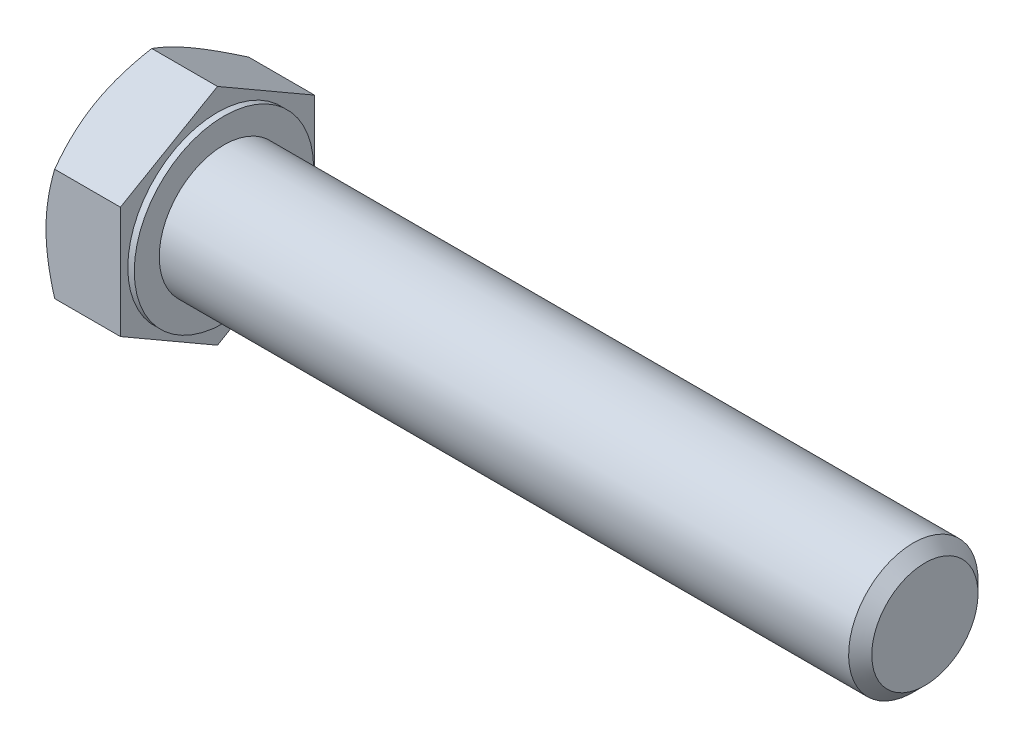
ISO-10303-21;
HEADER;
FILE_DESCRIPTION(('STEP AP214'),'2;1');
FILE_NAME('part.step','',(''),(''),'','','');
FILE_SCHEMA(('AUTOMOTIVE_DESIGN { 1 0 10303 214 1 1 1 1 }'));
ENDSEC;
DATA;
#1=APPLICATION_CONTEXT('core data for automotive mechanical design processes');
#2=APPLICATION_PROTOCOL_DEFINITION('international standard','automotive_design',2000,#1);
#3=PRODUCT_CONTEXT('',#1,'mechanical');
#4=PRODUCT('Part','Part','',(#3));
#5=PRODUCT_RELATED_PRODUCT_CATEGORY('part','',(#4));
#6=PRODUCT_DEFINITION_FORMATION('','',#4);
#7=PRODUCT_DEFINITION_CONTEXT('part definition',#1,'design');
#8=PRODUCT_DEFINITION('design','',#6,#7);
#9=PRODUCT_DEFINITION_SHAPE('','',#8);
#10=(LENGTH_UNIT() NAMED_UNIT(*) SI_UNIT(.MILLI.,.METRE.));
#11=(NAMED_UNIT(*) PLANE_ANGLE_UNIT() SI_UNIT($,.RADIAN.));
#12=(NAMED_UNIT(*) SI_UNIT($,.STERADIAN.) SOLID_ANGLE_UNIT());
#13=UNCERTAINTY_MEASURE_WITH_UNIT(LENGTH_MEASURE(1.E-05),#10,'distance_accuracy_value','');
#14=(GEOMETRIC_REPRESENTATION_CONTEXT(3) GLOBAL_UNCERTAINTY_ASSIGNED_CONTEXT((#13)) GLOBAL_UNIT_ASSIGNED_CONTEXT((#10,
#11,#12)) REPRESENTATION_CONTEXT('',''));
#15=CARTESIAN_POINT('',(0.,0.,0.));
#16=DIRECTION('',(0.,0.,1.));
#17=DIRECTION('',(1.,0.,0.));
#18=AXIS2_PLACEMENT_3D('',#15,#16,#17);
#19=CARTESIAN_POINT('',(-7.50009999999999,5.19615242270663,-8.99999999999999));
#20=DIRECTION('',(0.,-0.866025403784439,0.5));
#21=DIRECTION('',(0.,-0.5,-0.866025403784439));
#22=AXIS2_PLACEMENT_3D('',#19,#20,#21);
#23=PLANE('',#22);
#24=CARTESIAN_POINT('',(-6.69618575492888,10.3924203154671,0.000200000000008077));
#25=CARTESIAN_POINT('',(-6.76211799812596,10.2782163639797,-0.197607046401208));
#26=CARTESIAN_POINT('',(-6.8250585907897,10.1635669787649,-0.396185606649937));
#27=CARTESIAN_POINT('',(-6.94413100234448,9.93333715083389,-0.794955366044202));
#28=CARTESIAN_POINT('',(-7.00025988224795,9.81775632901306,-0.995147221818443));
#29=CARTESIAN_POINT('',(-7.10494803927105,9.58544915100227,-1.39751505709609));
#30=CARTESIAN_POINT('',(-7.15348922708723,9.46872074181185,-1.59969459250059));
#31=CARTESIAN_POINT('',(-7.2419514832121,9.23447001335912,-2.00542875589074));
#32=CARTESIAN_POINT('',(-7.28187431251674,9.11694786135373,-2.2089830941789));
#33=CARTESIAN_POINT('',(-7.3514153258529,8.88408932604661,-2.61230590830691));
#34=CARTESIAN_POINT('',(-7.38126249715222,8.76877014301846,-2.81204459239899));
#35=CARTESIAN_POINT('',(-7.43130669014093,8.53761579013204,-3.21241567598899));
#36=CARTESIAN_POINT('',(-7.45150456446248,8.42178066677661,-3.4130479949416));
#37=CARTESIAN_POINT('',(-7.48174565260267,8.1899095003667,-3.81466063597381));
#38=CARTESIAN_POINT('',(-7.49180039041571,8.07387383570152,-4.01564030266393));
#39=CARTESIAN_POINT('',(-7.50153766485494,7.84169571742973,-4.41778459991641));
#40=CARTESIAN_POINT('',(-7.50122052193526,7.72555326723327,-4.61894922457221));
#41=CARTESIAN_POINT('',(-7.49093604784684,7.50842142195781,-4.99503261253049));
#42=CARTESIAN_POINT('',(-7.48222325996962,7.40741671639993,-5.16997789436028));
#43=CARTESIAN_POINT('',(-7.45712265993465,7.20564389241817,-5.51945867708334));
#44=CARTESIAN_POINT('',(-7.44073433041935,7.10487579040239,-5.69399414955696));
#45=CARTESIAN_POINT('',(-7.38044344376419,6.80296159398079,-6.2169248772855));
#46=CARTESIAN_POINT('',(-7.32542251765889,6.60234990505053,-6.56439451510491));
#47=CARTESIAN_POINT('',(-7.18786952367487,6.1989985076226,-7.26301962875399));
#48=CARTESIAN_POINT('',(-7.10475438137291,5.99631027619252,-7.61408594368716));
#49=CARTESIAN_POINT('',(-6.91611746056355,5.59395639760763,-8.3109833040186));
#50=CARTESIAN_POINT('',(-6.81063998710666,5.39428559809852,-8.65682327355627));
#51=CARTESIAN_POINT('',(-6.69618575492888,5.19603695265279,-9.00019999999999));
#52=B_SPLINE_CURVE_WITH_KNOTS('',3,(#24,#25,#26,#27,#28,#29,#30,#31,#32,#33,#34,#35,#36,#37,#38,
#39,#40,#41,#42,#43,#44,#45,#46,#47,#48,#49,#50,#51),.UNSPECIFIED.,.F.,.F.,(4,2,2,2,2,2,2,2,2,2,
2,2,2,4),(0.,0.713219249102579,1.42674513853509,2.14194697262263,2.8570025303448,
3.55449749123034,4.25193080859215,4.94857085059645,5.64518936892662,6.25162976378284,
6.8581110406634,8.07193747617894,9.31268391793542,10.5509947443908),.UNSPECIFIED.);
#53=CARTESIAN_POINT('',(-6.69625242270666,10.3923048454132,0.));
#54=VERTEX_POINT('',#53);
#55=CARTESIAN_POINT('',(-7.50010000000001,7.79422863405995,-4.5));
#56=VERTEX_POINT('',#55);
#57=EDGE_CURVE('E176',#54,#56,#52,.T.);
#58=ORIENTED_EDGE('',*,*,#57,.F.);
#59=DIRECTION('',(1.,0.,0.));
#60=VECTOR('',#59,1.);
#61=CARTESIAN_POINT('',(-7.5001,10.3923048454133,0.));
#62=LINE('',#61,#60);
#63=CARTESIAN_POINT('',(-0.600099999999995,10.3923048454133,0.));
#64=VERTEX_POINT('',#63);
#65=EDGE_CURVE('E128',#54,#64,#62,.T.);
#66=ORIENTED_EDGE('',*,*,#65,.T.);
#67=DIRECTION('',(0.,-0.5,-0.866025403784439));
#68=VECTOR('',#67,1.);
#69=CARTESIAN_POINT('',(-0.600099999999995,5.19615242270663,-8.99999999999999));
#70=LINE('',#69,#68);
#71=CARTESIAN_POINT('',(-0.600099999999995,5.19615242270663,-8.99999999999999));
#72=VERTEX_POINT('',#71);
#73=EDGE_CURVE('E179',#64,#72,#70,.T.);
#74=ORIENTED_EDGE('',*,*,#73,.T.);
#75=DIRECTION('',(1.,0.,0.));
#76=VECTOR('',#75,1.);
#77=CARTESIAN_POINT('',(-7.50009999999999,5.19615242270663,-8.99999999999999));
#78=LINE('',#77,#76);
#79=CARTESIAN_POINT('',(-6.69625242270666,5.1961524227066,-8.99999999999999));
#80=VERTEX_POINT('',#79);
#81=EDGE_CURVE('E139',#80,#72,#78,.T.);
#82=ORIENTED_EDGE('',*,*,#81,.F.);
#83=EDGE_CURVE('E168',#56,#80,#52,.T.);
#84=ORIENTED_EDGE('',*,*,#83,.F.);
#85=EDGE_LOOP('',(#58,#66,#74,#82,#84));
#86=FACE_BOUND('',#85,.T.);
#87=ADVANCED_FACE('F33',(#86),#23,.F.);
#88=CARTESIAN_POINT('',(-7.50009999999999,-5.19615242270662,-8.99999999999999));
#89=DIRECTION('',(0.,0.,1.));
#90=DIRECTION('',(0.,-1.,0.));
#91=AXIS2_PLACEMENT_3D('',#88,#89,#90);
#92=PLANE('',#91);
#93=CARTESIAN_POINT('',(-3.19335965220855,-13.7809619774076,-9.));
#94=CARTESIAN_POINT('',(-3.28886114654046,-13.5833938697398,-9.));
#95=CARTESIAN_POINT('',(-3.38386837870638,-13.3855869578232,-9.));
#96=CARTESIAN_POINT('',(-3.57278086462839,-12.9894450865663,-9.));
#97=CARTESIAN_POINT('',(-3.66668610630412,-12.7911101214665,-9.));
#98=CARTESIAN_POINT('',(-3.9466058846242,-12.1951793772708,-9.));
#99=CARTESIAN_POINT('',(-4.13079333505547,-11.7967219832692,-9.));
#100=CARTESIAN_POINT('',(-4.49416084450511,-10.9947735410805,-9.));
#101=CARTESIAN_POINT('',(-4.67330621645447,-10.5912667360486,-8.99999999999999));
#102=CARTESIAN_POINT('',(-5.0239052775052,-9.78093737078416,-8.99999999999999));
#103=CARTESIAN_POINT('',(-5.19535936753848,-9.37411498469602,-8.99999999999999));
#104=CARTESIAN_POINT('',(-5.530561274567,-8.55145586737881,-8.99999999999999));
#105=CARTESIAN_POINT('',(-5.69418864051033,-8.13556978512743,-8.99999999999999));
#106=CARTESIAN_POINT('',(-6.00862845034194,-7.2988933563056,-8.99999999999999));
#107=CARTESIAN_POINT('',(-6.15943946847854,-6.87810247000693,-8.99999999999999));
#108=CARTESIAN_POINT('',(-6.44419344828308,-6.03180598391566,-8.99999999999999));
#109=CARTESIAN_POINT('',(-6.57817227138793,-5.60631258356886,-8.99999999999999));
#110=CARTESIAN_POINT('',(-6.8249129479646,-4.74929212788328,-8.99999999999999));
#111=CARTESIAN_POINT('',(-6.93768151099675,-4.31776702714856,-8.99999999999999));
#112=CARTESIAN_POINT('',(-7.13651882808314,-3.44831631587482,-8.99999999999999));
#113=CARTESIAN_POINT('',(-7.22258047297096,-3.01038903355498,-8.99999999999999));
#114=CARTESIAN_POINT('',(-7.32733357155701,-2.34964451655255,-8.99999999999999));
#115=CARTESIAN_POINT('',(-7.35819698289839,-2.12872697070467,-8.99999999999999));
#116=CARTESIAN_POINT('',(-7.41120341745491,-1.68585612058665,-8.99999999999999));
#117=CARTESIAN_POINT('',(-7.43334730399171,-1.46390292105968,-8.99999999999999));
#118=CARTESIAN_POINT('',(-7.46831876727257,-1.02066876581647,-8.99999999999999));
#119=CARTESIAN_POINT('',(-7.48120419533573,-0.799392393095819,-8.99999999999999));
#120=CARTESIAN_POINT('',(-7.49759061624053,-0.356492552156594,-8.99999999999999));
#121=CARTESIAN_POINT('',(-7.50109173095087,-0.134869088482895,-8.99999999999999));
#122=CARTESIAN_POINT('',(-7.49862610163484,0.308263692439023,-8.99999999999999));
#123=CARTESIAN_POINT('',(-7.4926620147366,0.529773024266123,-8.99999999999999));
#124=CARTESIAN_POINT('',(-7.47141429313999,0.972347240676831,-8.99999999999999));
#125=CARTESIAN_POINT('',(-7.45613019303537,1.19341210251216,-8.99999999999999));
#126=CARTESIAN_POINT('',(-7.40811041149167,1.72920526251532,-8.99999999999999));
#127=CARTESIAN_POINT('',(-7.37070507013926,2.04352190228058,-8.99999999999999));
#128=CARTESIAN_POINT('',(-7.27912940688443,2.66974660245865,-8.99999999999999));
#129=CARTESIAN_POINT('',(-7.2249545090038,2.98165398160677,-8.99999999999999));
#130=CARTESIAN_POINT('',(-7.10176114307715,3.60280284042295,-8.99999999999999));
#131=CARTESIAN_POINT('',(-7.03272864034212,3.91204150992661,-8.99999999999999));
#132=CARTESIAN_POINT('',(-6.88192632812695,4.52733722239756,-8.99999999999999));
#133=CARTESIAN_POINT('',(-6.80015771856231,4.83339456219493,-8.99999999999999));
#134=CARTESIAN_POINT('',(-6.62370199212766,5.44986573988036,-8.99999999999999));
#135=CARTESIAN_POINT('',(-6.52874734507003,5.76020247160934,-8.99999999999999));
#136=CARTESIAN_POINT('',(-6.32945598290243,6.37759566796843,-8.99999999999999));
#137=CARTESIAN_POINT('',(-6.22512573898084,6.68465423393874,-8.99999999999999));
#138=CARTESIAN_POINT('',(-6.00923822667562,7.29425898475909,-8.99999999999999));
#139=CARTESIAN_POINT('',(-5.89772494222608,7.59682084010854,-8.99999999999999));
#140=CARTESIAN_POINT('',(-5.66815317855826,8.19959709040558,-8.99999999999999));
#141=CARTESIAN_POINT('',(-5.55009205399556,8.49981047984898,-8.99999999999999));
#142=CARTESIAN_POINT('',(-5.42940473528119,8.79893322719989,-8.99999999999999));
#143=B_SPLINE_CURVE_WITH_KNOTS('',3,(#93,#94,#95,#96,#97,#98,#99,#100,#101,#102,#103,#104,#105,
#106,#107,#108,#109,#110,#111,#112,#113,#114,#115,#116,#117,#118,#119,#120,#121,#122,#123,#124,
#125,#126,#127,#128,#129,#130,#131,#132,#133,#134,#135,#136,#137,#138,#139,#140,#141,#142),
.UNSPECIFIED.,.F.,.F.,(4,2,2,2,2,2,2,2,2,2,2,2,2,2,2,2,2,2,2,2,2,2,2,2,4),(0.,0.658317213383776,
1.31664163671154,2.63350462236225,3.95790348304862,5.28223322492246,6.62282162595729,
7.96355896575433,9.30138955920962,10.6387962348219,11.9765586125403,12.6456025923959,
13.3145803134253,13.9793407019703,14.644092457611,15.3086576331614,15.9732559973029,
16.9223307168753,17.8716646430283,18.82189928942,19.7720444647979,20.745479751866,
21.7182482442908,22.685541342119,23.6532281165801),.UNSPECIFIED.);
#144=CARTESIAN_POINT('',(-7.50010000000001,0.,-9.));
#145=VERTEX_POINT('',#144);
#146=EDGE_CURVE('E170',#80,#145,#143,.F.);
#147=ORIENTED_EDGE('',*,*,#146,.F.);
#148=ORIENTED_EDGE('',*,*,#81,.T.);
#149=DIRECTION('',(0.,-1.,0.));
#150=VECTOR('',#149,1.);
#151=CARTESIAN_POINT('',(-0.600099999999993,-5.19615242270662,-8.99999999999999));
#152=LINE('',#151,#150);
#153=CARTESIAN_POINT('',(-0.600099999999993,-5.19615242270662,-8.99999999999999));
#154=VERTEX_POINT('',#153);
#155=EDGE_CURVE('E267',#72,#154,#152,.T.);
#156=ORIENTED_EDGE('',*,*,#155,.T.);
#157=DIRECTION('',(1.,0.,0.));
#158=VECTOR('',#157,1.);
#159=CARTESIAN_POINT('',(-7.50009999999999,-5.19615242270662,-8.99999999999999));
#160=LINE('',#159,#158);
#161=CARTESIAN_POINT('',(-6.69625242270666,-5.19615242270664,-8.99999999999997));
#162=VERTEX_POINT('',#161);
#163=EDGE_CURVE('E137',#162,#154,#160,.T.);
#164=ORIENTED_EDGE('',*,*,#163,.F.);
#165=EDGE_CURVE('E184',#145,#162,#143,.F.);
#166=ORIENTED_EDGE('',*,*,#165,.F.);
#167=EDGE_LOOP('',(#147,#148,#156,#164,#166));
#168=FACE_BOUND('',#167,.T.);
#169=ADVANCED_FACE('F235',(#168),#92,.F.);
#170=CARTESIAN_POINT('',(-7.50009999999999,-10.3923048454133,0.));
#171=DIRECTION('',(0.,0.866025403784438,0.500000000000001));
#172=DIRECTION('',(0.,-0.500000000000001,0.866025403784438));
#173=AXIS2_PLACEMENT_3D('',#170,#171,#172);
#174=PLANE('',#173);
#175=CARTESIAN_POINT('',(-6.69618575492888,-5.19603695265279,-9.00019999999999));
#176=CARTESIAN_POINT('',(-6.76211799812596,-5.31024090414013,-8.80239295359878));
#177=CARTESIAN_POINT('',(-6.8250585907897,-5.42489028935503,-8.60381439335005));
#178=CARTESIAN_POINT('',(-6.94413100234448,-5.65512011728599,-8.20504463395578));
#179=CARTESIAN_POINT('',(-7.00025988224795,-5.77070093910682,-8.00485277818155));
#180=CARTESIAN_POINT('',(-7.10494803927105,-6.00300811711761,-7.6024849429039));
#181=CARTESIAN_POINT('',(-7.15348922708723,-6.11973652630803,-7.4003054074994));
#182=CARTESIAN_POINT('',(-7.2419514832121,-6.35398725476076,-6.99457124410925));
#183=CARTESIAN_POINT('',(-7.28187431251674,-6.47150940676615,-6.79101690582109));
#184=CARTESIAN_POINT('',(-7.3514153258529,-6.70436794207327,-6.38769409169308));
#185=CARTESIAN_POINT('',(-7.38126249715222,-6.81968712510142,-6.18795540760099));
#186=CARTESIAN_POINT('',(-7.43130669014093,-7.05084147798785,-5.787584324011));
#187=CARTESIAN_POINT('',(-7.45150456446247,-7.16667660134327,-5.58695200505839));
#188=CARTESIAN_POINT('',(-7.48174565260267,-7.39854776775318,-5.18533936402618));
#189=CARTESIAN_POINT('',(-7.49180039041571,-7.51458343241836,-4.98435969733606));
#190=CARTESIAN_POINT('',(-7.50153766485493,-7.74676155069016,-4.58221540008357));
#191=CARTESIAN_POINT('',(-7.50122052193526,-7.86290400088661,-4.38105077542778));
#192=CARTESIAN_POINT('',(-7.49093604784684,-8.08003584616207,-4.0049673874695));
#193=CARTESIAN_POINT('',(-7.48222325996962,-8.18104055171995,-3.83002210563971));
#194=CARTESIAN_POINT('',(-7.45712265993464,-8.38281337570171,-3.48054132291665));
#195=CARTESIAN_POINT('',(-7.44073433041934,-8.4835814777175,-3.30600585044303));
#196=CARTESIAN_POINT('',(-7.38044344376418,-8.78549567413909,-2.7830751227145));
#197=CARTESIAN_POINT('',(-7.32542251765888,-8.98610736306935,-2.43560548489509));
#198=CARTESIAN_POINT('',(-7.18786952367486,-9.38945876049728,-1.736980371246));
#199=CARTESIAN_POINT('',(-7.10475438137291,-9.59214699192736,-1.38591405631283));
#200=CARTESIAN_POINT('',(-6.91611746056355,-9.99450087051225,-0.689016695981399));
#201=CARTESIAN_POINT('',(-6.81063998710666,-10.1941716700214,-0.343176726443727));
#202=CARTESIAN_POINT('',(-6.69618575492888,-10.3924203154671,0.000199999999994882));
#203=B_SPLINE_CURVE_WITH_KNOTS('',3,(#175,#176,#177,#178,#179,#180,#181,#182,#183,#184,#185,
#186,#187,#188,#189,#190,#191,#192,#193,#194,#195,#196,#197,#198,#199,#200,#201,#202),
.UNSPECIFIED.,.F.,.F.,(4,2,2,2,2,2,2,2,2,2,2,2,2,4),(0.,0.713219249102577,1.42674513853509,
2.14194697262263,2.8570025303448,3.55449749123034,4.25193080859215,4.94857085059645,
5.64518936892663,6.25162976378284,6.8581110406634,8.07193747617893,9.31268391793541,
10.5509947443908),.UNSPECIFIED.);
#204=CARTESIAN_POINT('',(-7.50010000000001,-7.79422863405995,-4.50000000000001));
#205=VERTEX_POINT('',#204);
#206=EDGE_CURVE('E230',#162,#205,#203,.T.);
#207=ORIENTED_EDGE('',*,*,#206,.F.);
#208=ORIENTED_EDGE('',*,*,#163,.T.);
#209=DIRECTION('',(0.,-0.500000000000001,0.866025403784438));
#210=VECTOR('',#209,1.);
#211=CARTESIAN_POINT('',(-0.600099999999993,-10.3923048454133,0.));
#212=LINE('',#211,#210);
#213=CARTESIAN_POINT('',(-0.600099999999993,-10.3923048454133,0.));
#214=VERTEX_POINT('',#213);
#215=EDGE_CURVE('E262',#154,#214,#212,.T.);
#216=ORIENTED_EDGE('',*,*,#215,.T.);
#217=DIRECTION('',(1.,0.,0.));
#218=VECTOR('',#217,1.);
#219=CARTESIAN_POINT('',(-7.50009999999999,-10.3923048454133,0.));
#220=LINE('',#219,#218);
#221=CARTESIAN_POINT('',(-6.69625242270666,-10.3923048454132,0.));
#222=VERTEX_POINT('',#221);
#223=EDGE_CURVE('E130',#222,#214,#220,.T.);
#224=ORIENTED_EDGE('',*,*,#223,.F.);
#225=EDGE_CURVE('E225',#205,#222,#203,.T.);
#226=ORIENTED_EDGE('',*,*,#225,.F.);
#227=EDGE_LOOP('',(#207,#208,#216,#224,#226));
#228=FACE_BOUND('',#227,.T.);
#229=ADVANCED_FACE('F231',(#228),#174,.F.);
#230=CARTESIAN_POINT('',(-7.50009999999999,-5.19615242270664,8.99999999999999));
#231=DIRECTION('',(0.,0.866025403784439,-0.499999999999999));
#232=DIRECTION('',(0.,0.499999999999999,0.866025403784439));
#233=AXIS2_PLACEMENT_3D('',#230,#231,#232);
#234=PLANE('',#233);
#235=CARTESIAN_POINT('',(-6.69618575492888,-10.3924203154671,-0.000200000000005551));
#236=CARTESIAN_POINT('',(-6.76211799812596,-10.2782163639797,0.197607046401211));
#237=CARTESIAN_POINT('',(-6.8250585907897,-10.1635669787649,0.39618560664994));
#238=CARTESIAN_POINT('',(-6.94413100234448,-9.9333371508339,0.794955366044204));
#239=CARTESIAN_POINT('',(-7.00025988224795,-9.81775632901307,0.995147221818445));
#240=CARTESIAN_POINT('',(-7.10494803927105,-9.58544915100227,1.39751505709609));
#241=CARTESIAN_POINT('',(-7.15348922708723,-9.46872074181185,1.59969459250059));
#242=CARTESIAN_POINT('',(-7.24195148321209,-9.23447001335912,2.00542875589074));
#243=CARTESIAN_POINT('',(-7.28187431251674,-9.11694786135373,2.2089830941789));
#244=CARTESIAN_POINT('',(-7.3514153258529,-8.88408932604661,2.61230590830691));
#245=CARTESIAN_POINT('',(-7.38126249715221,-8.76877014301846,2.812044592399));
#246=CARTESIAN_POINT('',(-7.43130669014093,-8.53761579013204,3.21241567598899));
#247=CARTESIAN_POINT('',(-7.45150456446247,-8.42178066677661,3.4130479949416));
#248=CARTESIAN_POINT('',(-7.48174565260267,-8.18990950036671,3.81466063597381));
#249=CARTESIAN_POINT('',(-7.49180039041571,-8.07387383570153,4.01564030266393));
#250=CARTESIAN_POINT('',(-7.50153766485493,-7.84169571742973,4.41778459991642));
#251=CARTESIAN_POINT('',(-7.50122052193526,-7.72555326723328,4.61894922457222));
#252=CARTESIAN_POINT('',(-7.49093604784684,-7.50842142195782,4.9950326125305));
#253=CARTESIAN_POINT('',(-7.48222325996962,-7.40741671639993,5.16997789436029));
#254=CARTESIAN_POINT('',(-7.45712265993464,-7.20564389241818,5.51945867708334));
#255=CARTESIAN_POINT('',(-7.44073433041934,-7.10487579040239,5.69399414955696));
#256=CARTESIAN_POINT('',(-7.38044344376418,-6.8029615939808,6.2169248772855));
#257=CARTESIAN_POINT('',(-7.32542251765888,-6.60234990505054,6.56439451510491));
#258=CARTESIAN_POINT('',(-7.18786952367486,-6.19899850762261,7.26301962875399));
#259=CARTESIAN_POINT('',(-7.10475438137291,-5.99631027619253,7.61408594368716));
#260=CARTESIAN_POINT('',(-6.91611746056355,-5.59395639760764,8.3109833040186));
#261=CARTESIAN_POINT('',(-6.81063998710666,-5.39428559809853,8.65682327355627));
#262=CARTESIAN_POINT('',(-6.69618575492888,-5.1960369526528,9.00019999999999));
#263=B_SPLINE_CURVE_WITH_KNOTS('',3,(#235,#236,#237,#238,#239,#240,#241,#242,#243,#244,#245,
#246,#247,#248,#249,#250,#251,#252,#253,#254,#255,#256,#257,#258,#259,#260,#261,#262),
.UNSPECIFIED.,.F.,.F.,(4,2,2,2,2,2,2,2,2,2,2,2,2,4),(0.,0.713219249102578,1.42674513853509,
2.14194697262263,2.8570025303448,3.55449749123034,4.25193080859215,4.94857085059645,
5.64518936892662,6.25162976378284,6.8581110406634,8.07193747617893,9.31268391793541,
10.5509947443908),.UNSPECIFIED.);
#264=CARTESIAN_POINT('',(-7.50010000000001,-7.79422863405995,4.5));
#265=VERTEX_POINT('',#264);
#266=EDGE_CURVE('E56',#222,#265,#263,.T.);
#267=ORIENTED_EDGE('',*,*,#266,.F.);
#268=ORIENTED_EDGE('',*,*,#223,.T.);
#269=DIRECTION('',(0.,0.499999999999999,0.866025403784439));
#270=VECTOR('',#269,1.);
#271=CARTESIAN_POINT('',(-0.600099999999993,-5.19615242270664,8.99999999999999));
#272=LINE('',#271,#270);
#273=CARTESIAN_POINT('',(-0.600099999999993,-5.19615242270664,8.99999999999999));
#274=VERTEX_POINT('',#273);
#275=EDGE_CURVE('E259',#214,#274,#272,.T.);
#276=ORIENTED_EDGE('',*,*,#275,.T.);
#277=DIRECTION('',(1.,0.,0.));
#278=VECTOR('',#277,1.);
#279=CARTESIAN_POINT('',(-7.50009999999999,-5.19615242270664,8.99999999999999));
#280=LINE('',#279,#278);
#281=CARTESIAN_POINT('',(-6.69625242270666,-5.1961524227066,8.99999999999999));
#282=VERTEX_POINT('',#281);
#283=EDGE_CURVE('E127',#282,#274,#280,.T.);
#284=ORIENTED_EDGE('',*,*,#283,.F.);
#285=EDGE_CURVE('E220',#265,#282,#263,.T.);
#286=ORIENTED_EDGE('',*,*,#285,.F.);
#287=EDGE_LOOP('',(#267,#268,#276,#284,#286));
#288=FACE_BOUND('',#287,.T.);
#289=ADVANCED_FACE('F234',(#288),#234,.F.);
#290=CARTESIAN_POINT('',(-7.50009999999999,5.19615242270662,9.));
#291=DIRECTION('',(0.,0.,-1.));
#292=DIRECTION('',(0.,1.,0.));
#293=AXIS2_PLACEMENT_3D('',#290,#291,#292);
#294=PLANE('',#293);
#295=CARTESIAN_POINT('',(-3.19335965220854,-13.7809619774077,8.99999999999999));
#296=CARTESIAN_POINT('',(-3.28886114654046,-13.5833938697398,8.99999999999999));
#297=CARTESIAN_POINT('',(-3.38386837870637,-13.3855869578232,8.99999999999999));
#298=CARTESIAN_POINT('',(-3.57278086462838,-12.9894450865663,8.99999999999999));
#299=CARTESIAN_POINT('',(-3.66668610630412,-12.7911101214665,8.99999999999999));
#300=CARTESIAN_POINT('',(-3.94660588462419,-12.1951793772709,8.99999999999999));
#301=CARTESIAN_POINT('',(-4.13079333505547,-11.7967219832692,8.99999999999999));
#302=CARTESIAN_POINT('',(-4.49416084450511,-10.9947735410805,8.99999999999999));
#303=CARTESIAN_POINT('',(-4.67330621645447,-10.5912667360486,8.99999999999999));
#304=CARTESIAN_POINT('',(-5.0239052775052,-9.78093737078417,8.99999999999999));
#305=CARTESIAN_POINT('',(-5.19535936753848,-9.37411498469603,8.99999999999999));
#306=CARTESIAN_POINT('',(-5.530561274567,-8.55145586737882,8.99999999999999));
#307=CARTESIAN_POINT('',(-5.69418864051033,-8.13556978512744,8.99999999999999));
#308=CARTESIAN_POINT('',(-6.00862845034194,-7.29889335630561,8.99999999999999));
#309=CARTESIAN_POINT('',(-6.15943946847854,-6.87810247000694,8.99999999999999));
#310=CARTESIAN_POINT('',(-6.44419344828308,-6.03180598391566,8.99999999999999));
#311=CARTESIAN_POINT('',(-6.57817227138793,-5.60631258356887,8.99999999999999));
#312=CARTESIAN_POINT('',(-6.8249129479646,-4.74929212788328,8.99999999999999));
#313=CARTESIAN_POINT('',(-6.93768151099675,-4.31776702714857,8.99999999999999));
#314=CARTESIAN_POINT('',(-7.13651882808314,-3.44831631587483,8.99999999999999));
#315=CARTESIAN_POINT('',(-7.22258047297096,-3.01038903355499,8.99999999999999));
#316=CARTESIAN_POINT('',(-7.32733357155701,-2.34964451655256,8.99999999999999));
#317=CARTESIAN_POINT('',(-7.35819698289839,-2.12872697070468,8.99999999999999));
#318=CARTESIAN_POINT('',(-7.41120341745491,-1.68585612058666,8.99999999999999));
#319=CARTESIAN_POINT('',(-7.43334730399171,-1.46390292105969,8.99999999999999));
#320=CARTESIAN_POINT('',(-7.46831876727257,-1.02066876581648,8.99999999999999));
#321=CARTESIAN_POINT('',(-7.48120419533573,-0.799392393095829,8.99999999999999));
#322=CARTESIAN_POINT('',(-7.49759061624053,-0.356492552156604,8.99999999999999));
#323=CARTESIAN_POINT('',(-7.50109173095087,-0.134869088482904,8.99999999999999));
#324=CARTESIAN_POINT('',(-7.49862610163483,0.308263692439015,8.99999999999999));
#325=CARTESIAN_POINT('',(-7.4926620147366,0.529773024266113,8.99999999999999));
#326=CARTESIAN_POINT('',(-7.47141429313999,0.972347240676822,8.99999999999999));
#327=CARTESIAN_POINT('',(-7.45613019303537,1.19341210251215,9.));
#328=CARTESIAN_POINT('',(-7.40811041149167,1.72920526251531,9.));
#329=CARTESIAN_POINT('',(-7.37070507013926,2.04352190228057,9.));
#330=CARTESIAN_POINT('',(-7.27912940688443,2.66974660245864,9.));
#331=CARTESIAN_POINT('',(-7.2249545090038,2.98165398160676,9.));
#332=CARTESIAN_POINT('',(-7.10176114307715,3.60280284042294,9.));
#333=CARTESIAN_POINT('',(-7.03272864034212,3.9120415099266,9.));
#334=CARTESIAN_POINT('',(-6.88192632812695,4.52733722239755,9.));
#335=CARTESIAN_POINT('',(-6.80015771856231,4.83339456219492,9.));
#336=CARTESIAN_POINT('',(-6.62370199212766,5.44986573988035,9.));
#337=CARTESIAN_POINT('',(-6.52874734507003,5.76020247160933,9.));
#338=CARTESIAN_POINT('',(-6.32945598290243,6.37759566796842,9.));
#339=CARTESIAN_POINT('',(-6.22512573898084,6.68465423393873,9.));
#340=CARTESIAN_POINT('',(-6.00923822667562,7.29425898475908,9.));
#341=CARTESIAN_POINT('',(-5.89772494222608,7.59682084010852,9.));
#342=CARTESIAN_POINT('',(-5.66815317855826,8.19959709040556,9.));
#343=CARTESIAN_POINT('',(-5.55009205399556,8.49981047984897,9.));
#344=CARTESIAN_POINT('',(-5.42940473528119,8.79893322719987,9.));
#345=B_SPLINE_CURVE_WITH_KNOTS('',3,(#295,#296,#297,#298,#299,#300,#301,#302,#303,#304,#305,
#306,#307,#308,#309,#310,#311,#312,#313,#314,#315,#316,#317,#318,#319,#320,#321,#322,#323,#324,
#325,#326,#327,#328,#329,#330,#331,#332,#333,#334,#335,#336,#337,#338,#339,#340,#341,#342,#343,
#344),.UNSPECIFIED.,.F.,.F.,(4,2,2,2,2,2,2,2,2,2,2,2,2,2,2,2,2,2,2,2,2,2,2,2,4),(0.,
0.658317213383777,1.31664163671154,2.63350462236225,3.95790348304863,5.28223322492247,
6.62282162595729,7.96355896575434,9.30138955920963,10.6387962348219,11.9765586125403,
12.645602592396,13.3145803134253,13.9793407019703,14.644092457611,15.3086576331614,
15.9732559973029,16.9223307168754,17.8716646430283,18.82189928942,19.7720444647979,
20.745479751866,21.7182482442908,22.685541342119,23.6532281165801),.UNSPECIFIED.);
#346=CARTESIAN_POINT('',(-7.50010000000001,0.,9.));
#347=VERTEX_POINT('',#346);
#348=EDGE_CURVE('E48',#282,#347,#345,.T.);
#349=ORIENTED_EDGE('',*,*,#348,.F.);
#350=ORIENTED_EDGE('',*,*,#283,.T.);
#351=DIRECTION('',(0.,1.,0.));
#352=VECTOR('',#351,1.);
#353=CARTESIAN_POINT('',(-0.600099999999995,5.19615242270662,9.));
#354=LINE('',#353,#352);
#355=CARTESIAN_POINT('',(-0.600099999999995,5.19615242270662,9.));
#356=VERTEX_POINT('',#355);
#357=EDGE_CURVE('E125',#274,#356,#354,.T.);
#358=ORIENTED_EDGE('',*,*,#357,.T.);
#359=DIRECTION('',(1.,0.,0.));
#360=VECTOR('',#359,1.);
#361=CARTESIAN_POINT('',(-7.50009999999999,5.19615242270662,9.));
#362=LINE('',#361,#360);
#363=CARTESIAN_POINT('',(-6.69625242270666,5.19615242270663,8.99999999999997));
#364=VERTEX_POINT('',#363);
#365=EDGE_CURVE('E118',#364,#356,#362,.T.);
#366=ORIENTED_EDGE('',*,*,#365,.F.);
#367=EDGE_CURVE('E105',#347,#364,#345,.T.);
#368=ORIENTED_EDGE('',*,*,#367,.F.);
#369=EDGE_LOOP('',(#349,#350,#358,#366,#368));
#370=FACE_BOUND('',#369,.T.);
#371=ADVANCED_FACE('F123',(#370),#294,.F.);
#372=CARTESIAN_POINT('',(-7.5001,10.3923048454133,0.));
#373=DIRECTION('',(0.,-0.866025403784438,-0.500000000000001));
#374=DIRECTION('',(0.,0.500000000000001,-0.866025403784438));
#375=AXIS2_PLACEMENT_3D('',#372,#373,#374);
#376=PLANE('',#375);
#377=CARTESIAN_POINT('',(-6.69618575492888,5.19603695265278,9.0002));
#378=CARTESIAN_POINT('',(-6.76211799812596,5.31024090414013,8.80239295359878));
#379=CARTESIAN_POINT('',(-6.8250585907897,5.42489028935502,8.60381439335005));
#380=CARTESIAN_POINT('',(-6.94413100234448,5.65512011728598,8.20504463395579));
#381=CARTESIAN_POINT('',(-7.00025988224795,5.77070093910681,8.00485277818155));
#382=CARTESIAN_POINT('',(-7.10494803927105,6.00300811711761,7.6024849429039));
#383=CARTESIAN_POINT('',(-7.15348922708723,6.11973652630803,7.4003054074994));
#384=CARTESIAN_POINT('',(-7.2419514832121,6.35398725476076,6.99457124410925));
#385=CARTESIAN_POINT('',(-7.28187431251674,6.47150940676615,6.79101690582109));
#386=CARTESIAN_POINT('',(-7.3514153258529,6.70436794207327,6.38769409169309));
#387=CARTESIAN_POINT('',(-7.38126249715222,6.81968712510142,6.187955407601));
#388=CARTESIAN_POINT('',(-7.43130669014093,7.05084147798784,5.78758432401101));
#389=CARTESIAN_POINT('',(-7.45150456446248,7.16667660134327,5.5869520050584));
#390=CARTESIAN_POINT('',(-7.48174565260267,7.39854776775318,5.18533936402618));
#391=CARTESIAN_POINT('',(-7.49180039041571,7.51458343241836,4.98435969733607));
#392=CARTESIAN_POINT('',(-7.50153766485493,7.74676155069015,4.58221540008358));
#393=CARTESIAN_POINT('',(-7.50122052193526,7.86290400088661,4.38105077542778));
#394=CARTESIAN_POINT('',(-7.49093604784684,8.08003584616207,4.0049673874695));
#395=CARTESIAN_POINT('',(-7.48222325996962,8.18104055171995,3.83002210563971));
#396=CARTESIAN_POINT('',(-7.45712265993465,8.38281337570171,3.48054132291666));
#397=CARTESIAN_POINT('',(-7.44073433041935,8.48358147771749,3.30600585044303));
#398=CARTESIAN_POINT('',(-7.38044344376419,8.78549567413909,2.7830751227145));
#399=CARTESIAN_POINT('',(-7.32542251765889,8.98610736306935,2.43560548489509));
#400=CARTESIAN_POINT('',(-7.18786952367486,9.38945876049728,1.73698037124601));
#401=CARTESIAN_POINT('',(-7.10475438137291,9.59214699192736,1.38591405631283));
#402=CARTESIAN_POINT('',(-6.91611746056355,9.99450087051225,0.689016695981401));
#403=CARTESIAN_POINT('',(-6.81063998710666,10.1941716700214,0.343176726443728));
#404=CARTESIAN_POINT('',(-6.69618575492888,10.3924203154671,-0.000199999999991533));
#405=B_SPLINE_CURVE_WITH_KNOTS('',3,(#377,#378,#379,#380,#381,#382,#383,#384,#385,#386,#387,
#388,#389,#390,#391,#392,#393,#394,#395,#396,#397,#398,#399,#400,#401,#402,#403,#404),
.UNSPECIFIED.,.F.,.F.,(4,2,2,2,2,2,2,2,2,2,2,2,2,4),(0.,0.713219249102577,1.42674513853509,
2.14194697262263,2.8570025303448,3.55449749123034,4.25193080859215,4.94857085059645,
5.64518936892663,6.25162976378284,6.8581110406634,8.07193747617893,9.31268391793541,
10.5509947443908),.UNSPECIFIED.);
#406=CARTESIAN_POINT('',(-7.50009999999999,7.79422863405994,4.5));
#407=VERTEX_POINT('',#406);
#408=EDGE_CURVE('E108',#364,#407,#405,.T.);
#409=ORIENTED_EDGE('',*,*,#408,.F.);
#410=ORIENTED_EDGE('',*,*,#365,.T.);
#411=DIRECTION('',(0.,0.500000000000001,-0.866025403784438));
#412=VECTOR('',#411,1.);
#413=CARTESIAN_POINT('',(-0.600099999999995,10.3923048454133,0.));
#414=LINE('',#413,#412);
#415=EDGE_CURVE('E132',#356,#64,#414,.T.);
#416=ORIENTED_EDGE('',*,*,#415,.T.);
#417=ORIENTED_EDGE('',*,*,#65,.F.);
#418=EDGE_CURVE('E121',#407,#54,#405,.T.);
#419=ORIENTED_EDGE('',*,*,#418,.F.);
#420=EDGE_LOOP('',(#409,#410,#416,#417,#419));
#421=FACE_BOUND('',#420,.T.);
#422=ADVANCED_FACE('F116',(#421),#376,.F.);
#423=CARTESIAN_POINT('',(65.,0.,0.));
#424=DIRECTION('',(1.,0.,0.));
#425=DIRECTION('',(0.,1.,0.));
#426=AXIS2_PLACEMENT_3D('',#423,#424,#425);
#427=PLANE('',#426);
#428=CARTESIAN_POINT('',(65.,0.,0.));
#429=DIRECTION('',(1.,0.,0.));
#430=DIRECTION('',(0.,1.,0.));
#431=AXIS2_PLACEMENT_3D('',#428,#429,#430);
#432=CIRCLE('',#431,4.92636250000004);
#433=CARTESIAN_POINT('',(65.,4.92636250000004,0.));
#434=VERTEX_POINT('',#433);
#435=EDGE_CURVE('E41',#434,#434,#432,.T.);
#436=ORIENTED_EDGE('',*,*,#435,.T.);
#437=EDGE_LOOP('',(#436));
#438=FACE_BOUND('',#437,.T.);
#439=ADVANCED_FACE('F279',(#438),#427,.T.);
#440=CARTESIAN_POINT('',(65.,0.,0.));
#441=DIRECTION('',(1.,0.,0.));
#442=DIRECTION('',(0.,1.,0.));
#443=AXIS2_PLACEMENT_3D('',#440,#441,#442);
#444=CYLINDRICAL_SURFACE('',#443,6.);
#445=CARTESIAN_POINT('',(63.9264625000001,0.,0.));
#446=DIRECTION('',(1.,0.,0.));
#447=DIRECTION('',(0.,1.,0.));
#448=AXIS2_PLACEMENT_3D('',#445,#446,#447);
#449=CIRCLE('',#448,6.);
#450=CARTESIAN_POINT('',(63.9264625000001,6.00000000000001,0.));
#451=VERTEX_POINT('',#450);
#452=EDGE_CURVE('E11',#451,#451,#449,.F.);
#453=ORIENTED_EDGE('',*,*,#452,.T.);
#454=EDGE_LOOP('',(#453));
#455=FACE_BOUND('',#454,.T.);
#456=CARTESIAN_POINT('',(0.,0.,0.));
#457=DIRECTION('',(1.,0.,0.));
#458=DIRECTION('',(0.,1.,0.));
#459=AXIS2_PLACEMENT_3D('',#456,#457,#458);
#460=CIRCLE('',#459,6.);
#461=CARTESIAN_POINT('',(0.,6.,0.));
#462=VERTEX_POINT('',#461);
#463=EDGE_CURVE('E147',#462,#462,#460,.T.);
#464=ORIENTED_EDGE('',*,*,#463,.T.);
#465=EDGE_LOOP('',(#464));
#466=FACE_BOUND('',#465,.T.);
#467=ADVANCED_FACE('F322',(#455,#466),#444,.T.);
#468=CARTESIAN_POINT('',(0.,6.,0.));
#469=DIRECTION('',(1.,0.,0.));
#470=DIRECTION('',(0.,1.,0.));
#471=AXIS2_PLACEMENT_3D('',#468,#469,#470);
#472=PLANE('',#471);
#473=CARTESIAN_POINT('',(0.,0.,0.));
#474=DIRECTION('',(1.,0.,0.));
#475=DIRECTION('',(0.,1.,0.));
#476=AXIS2_PLACEMENT_3D('',#473,#474,#475);
#477=CIRCLE('',#476,8.315);
#478=CARTESIAN_POINT('',(0.,8.315,0.));
#479=VERTEX_POINT('',#478);
#480=EDGE_CURVE('E144',#479,#479,#477,.T.);
#481=ORIENTED_EDGE('',*,*,#480,.T.);
#482=EDGE_LOOP('',(#481));
#483=FACE_BOUND('',#482,.T.);
#484=ORIENTED_EDGE('',*,*,#463,.F.);
#485=EDGE_LOOP('',(#484));
#486=FACE_BOUND('',#485,.T.);
#487=ADVANCED_FACE('F274',(#483,#486),#472,.T.);
#488=CARTESIAN_POINT('',(65.,0.,0.));
#489=DIRECTION('',(1.,0.,0.));
#490=DIRECTION('',(0.,1.,0.));
#491=AXIS2_PLACEMENT_3D('',#488,#489,#490);
#492=CYLINDRICAL_SURFACE('',#491,8.315);
#493=CARTESIAN_POINT('',(-0.600099999999992,0.,0.));
#494=DIRECTION('',(1.,0.,0.));
#495=DIRECTION('',(0.,1.,0.));
#496=AXIS2_PLACEMENT_3D('',#493,#494,#495);
#497=CIRCLE('',#496,8.315);
#498=CARTESIAN_POINT('',(-0.600099999999993,8.315,0.));
#499=VERTEX_POINT('',#498);
#500=EDGE_CURVE('E141',#499,#499,#497,.T.);
#501=ORIENTED_EDGE('',*,*,#500,.T.);
#502=EDGE_LOOP('',(#501));
#503=FACE_BOUND('',#502,.T.);
#504=ORIENTED_EDGE('',*,*,#480,.F.);
#505=EDGE_LOOP('',(#504));
#506=FACE_BOUND('',#505,.T.);
#507=ADVANCED_FACE('F269',(#503,#506),#492,.T.);
#508=CARTESIAN_POINT('',(-0.600099999999994,0.,0.));
#509=DIRECTION('',(1.,0.,0.));
#510=DIRECTION('',(0.,1.,0.));
#511=AXIS2_PLACEMENT_3D('',#508,#509,#510);
#512=PLANE('',#511);
#513=ORIENTED_EDGE('',*,*,#500,.F.);
#514=EDGE_LOOP('',(#513));
#515=FACE_BOUND('',#514,.T.);
#516=ORIENTED_EDGE('',*,*,#73,.F.);
#517=ORIENTED_EDGE('',*,*,#415,.F.);
#518=ORIENTED_EDGE('',*,*,#357,.F.);
#519=ORIENTED_EDGE('',*,*,#275,.F.);
#520=ORIENTED_EDGE('',*,*,#215,.F.);
#521=ORIENTED_EDGE('',*,*,#155,.F.);
#522=EDGE_LOOP('',(#516,#517,#518,#519,#520,#521));
#523=FACE_BOUND('',#522,.T.);
#524=ADVANCED_FACE('F203',(#515,#523),#512,.T.);
#525=CARTESIAN_POINT('',(-7.50010000000001,0.,0.));
#526=DIRECTION('',(1.,0.,0.));
#527=DIRECTION('',(0.,0.,-1.));
#528=AXIS2_PLACEMENT_3D('',#525,#526,#527);
#529=CONICAL_SURFACE('',#528,9.,1.0471975511966);
#530=ORIENTED_EDGE('',*,*,#57,.T.);
#531=CARTESIAN_POINT('',(-7.50009999999999,0.,0.));
#532=DIRECTION('',(1.,0.,0.));
#533=DIRECTION('',(0.,1.,0.));
#534=AXIS2_PLACEMENT_3D('',#531,#532,#533);
#535=CIRCLE('',#534,9.00000000000003);
#536=EDGE_CURVE('E150',#56,#407,#535,.T.);
#537=ORIENTED_EDGE('',*,*,#536,.T.);
#538=ORIENTED_EDGE('',*,*,#418,.T.);
#539=EDGE_LOOP('',(#530,#537,#538));
#540=FACE_BOUND('',#539,.T.);
#541=ADVANCED_FACE('F177',(#540),#529,.T.);
#542=ORIENTED_EDGE('',*,*,#83,.T.);
#543=ORIENTED_EDGE('',*,*,#146,.T.);
#544=EDGE_CURVE('E152',#145,#56,#535,.T.);
#545=ORIENTED_EDGE('',*,*,#544,.T.);
#546=EDGE_LOOP('',(#542,#543,#545));
#547=FACE_BOUND('',#546,.T.);
#548=ADVANCED_FACE('F166',(#547),#529,.T.);
#549=ORIENTED_EDGE('',*,*,#165,.T.);
#550=ORIENTED_EDGE('',*,*,#206,.T.);
#551=EDGE_CURVE('E159',#205,#145,#535,.T.);
#552=ORIENTED_EDGE('',*,*,#551,.T.);
#553=EDGE_LOOP('',(#549,#550,#552));
#554=FACE_BOUND('',#553,.T.);
#555=ADVANCED_FACE('F248',(#554),#529,.T.);
#556=ORIENTED_EDGE('',*,*,#225,.T.);
#557=ORIENTED_EDGE('',*,*,#266,.T.);
#558=EDGE_CURVE('E157',#265,#205,#535,.T.);
#559=ORIENTED_EDGE('',*,*,#558,.T.);
#560=EDGE_LOOP('',(#556,#557,#559));
#561=FACE_BOUND('',#560,.T.);
#562=ADVANCED_FACE('F252',(#561),#529,.T.);
#563=ORIENTED_EDGE('',*,*,#285,.T.);
#564=ORIENTED_EDGE('',*,*,#348,.T.);
#565=EDGE_CURVE('E153',#347,#265,#535,.T.);
#566=ORIENTED_EDGE('',*,*,#565,.T.);
#567=EDGE_LOOP('',(#563,#564,#566));
#568=FACE_BOUND('',#567,.T.);
#569=ADVANCED_FACE('F257',(#568),#529,.T.);
#570=ORIENTED_EDGE('',*,*,#367,.T.);
#571=ORIENTED_EDGE('',*,*,#408,.T.);
#572=CARTESIAN_POINT('',(-7.50010000000001,0.,0.));
#573=DIRECTION('',(-1.,0.,0.));
#574=DIRECTION('',(0.,0.,1.));
#575=AXIS2_PLACEMENT_3D('',#572,#573,#574);
#576=CIRCLE('',#575,9.);
#577=EDGE_CURVE('E110',#347,#407,#576,.T.);
#578=ORIENTED_EDGE('',*,*,#577,.F.);
#579=EDGE_LOOP('',(#570,#571,#578));
#580=FACE_BOUND('',#579,.T.);
#581=ADVANCED_FACE('F107',(#580),#529,.T.);
#582=CARTESIAN_POINT('',(-7.50009999999999,0.,0.));
#583=DIRECTION('',(1.,0.,0.));
#584=DIRECTION('',(0.,1.,0.));
#585=AXIS2_PLACEMENT_3D('',#582,#583,#584);
#586=PLANE('',#585);
#587=ORIENTED_EDGE('',*,*,#577,.T.);
#588=ORIENTED_EDGE('',*,*,#536,.F.);
#589=ORIENTED_EDGE('',*,*,#544,.F.);
#590=ORIENTED_EDGE('',*,*,#551,.F.);
#591=ORIENTED_EDGE('',*,*,#558,.F.);
#592=ORIENTED_EDGE('',*,*,#565,.F.);
#593=EDGE_LOOP('',(#587,#588,#589,#590,#591,#592));
#594=FACE_BOUND('',#593,.T.);
#595=ADVANCED_FACE('F181',(#594),#586,.F.);
#596=CARTESIAN_POINT('',(65.,0.,0.));
#597=DIRECTION('',(-1.,0.,0.));
#598=DIRECTION('',(0.,-1.,0.));
#599=AXIS2_PLACEMENT_3D('',#596,#597,#598);
#600=CONICAL_SURFACE('',#599,4.92636250000004,0.785444736219849);
#601=ORIENTED_EDGE('',*,*,#452,.F.);
#602=EDGE_LOOP('',(#601));
#603=FACE_BOUND('',#602,.T.);
#604=ORIENTED_EDGE('',*,*,#435,.F.);
#605=EDGE_LOOP('',(#604));
#606=FACE_BOUND('',#605,.T.);
#607=ADVANCED_FACE('F35',(#603,#606),#600,.T.);
#608=CLOSED_SHELL('',(#87,#169,#229,#289,#371,#422,#439,#467,#487,#507,#524,#541,#548,#555,#562,
#569,#581,#595,#607));
#609=MANIFOLD_SOLID_BREP('B2',#608);
#610=ADVANCED_BREP_SHAPE_REPRESENTATION('',(#18,#609),#14);
#611=SHAPE_DEFINITION_REPRESENTATION(#9,#610);
ENDSEC;
END-ISO-10303-21;
